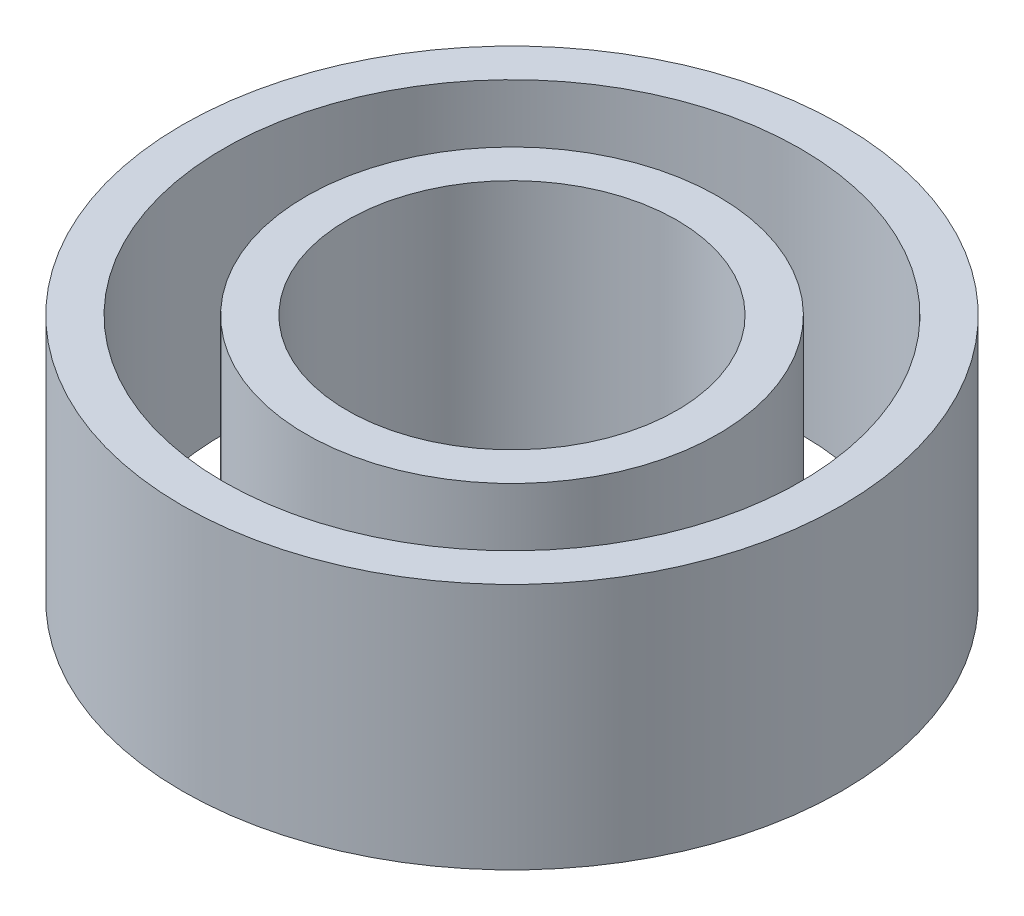
ISO-10303-21;
HEADER;
FILE_DESCRIPTION(('STEP AP214'),'2;1');
FILE_NAME('part.step','',(''),(''),'','','');
FILE_SCHEMA(('AUTOMOTIVE_DESIGN { 1 0 10303 214 1 1 1 1 }'));
ENDSEC;
DATA;
#1=APPLICATION_CONTEXT('core data for automotive mechanical design processes');
#2=APPLICATION_PROTOCOL_DEFINITION('international standard','automotive_design',2000,#1);
#3=PRODUCT_CONTEXT('',#1,'mechanical');
#4=PRODUCT('Part','Part','',(#3));
#5=PRODUCT_RELATED_PRODUCT_CATEGORY('part','',(#4));
#6=PRODUCT_DEFINITION_FORMATION('','',#4);
#7=PRODUCT_DEFINITION_CONTEXT('part definition',#1,'design');
#8=PRODUCT_DEFINITION('design','',#6,#7);
#9=PRODUCT_DEFINITION_SHAPE('','',#8);
#10=(LENGTH_UNIT() NAMED_UNIT(*) SI_UNIT(.MILLI.,.METRE.));
#11=(NAMED_UNIT(*) PLANE_ANGLE_UNIT() SI_UNIT($,.RADIAN.));
#12=(NAMED_UNIT(*) SI_UNIT($,.STERADIAN.) SOLID_ANGLE_UNIT());
#13=UNCERTAINTY_MEASURE_WITH_UNIT(LENGTH_MEASURE(1.E-05),#10,'distance_accuracy_value','');
#14=(GEOMETRIC_REPRESENTATION_CONTEXT(3) GLOBAL_UNCERTAINTY_ASSIGNED_CONTEXT((#13)) GLOBAL_UNIT_ASSIGNED_CONTEXT((#10,
#11,#12)) REPRESENTATION_CONTEXT('',''));
#15=CARTESIAN_POINT('',(0.,0.,0.));
#16=DIRECTION('',(0.,0.,1.));
#17=DIRECTION('',(1.,0.,0.));
#18=AXIS2_PLACEMENT_3D('',#15,#16,#17);
#19=CARTESIAN_POINT('',(0.,0.,0.));
#20=DIRECTION('',(0.,-1.,0.));
#21=DIRECTION('',(0.,0.,-1.));
#22=AXIS2_PLACEMENT_3D('',#19,#20,#21);
#23=CYLINDRICAL_SURFACE('',#22,3.5);
#24=CARTESIAN_POINT('',(0.,1.,0.));
#25=DIRECTION('',(0.,-1.,0.));
#26=DIRECTION('',(0.,0.,-1.));
#27=AXIS2_PLACEMENT_3D('',#24,#25,#26);
#28=CIRCLE('',#27,3.5);
#29=CARTESIAN_POINT('',(0.,1.,-3.5));
#30=VERTEX_POINT('',#29);
#31=EDGE_CURVE('E59',#30,#30,#28,.T.);
#32=ORIENTED_EDGE('',*,*,#31,.T.);
#33=EDGE_LOOP('',(#32));
#34=FACE_BOUND('',#33,.T.);
#35=CARTESIAN_POINT('',(0.,4.,0.));
#36=DIRECTION('',(0.,-1.,0.));
#37=DIRECTION('',(0.,0.,-1.));
#38=AXIS2_PLACEMENT_3D('',#35,#36,#37);
#39=CIRCLE('',#38,3.5);
#40=CARTESIAN_POINT('',(0.,4.,-3.5));
#41=VERTEX_POINT('',#40);
#42=EDGE_CURVE('E11',#41,#41,#39,.T.);
#43=ORIENTED_EDGE('',*,*,#42,.F.);
#44=EDGE_LOOP('',(#43));
#45=FACE_BOUND('',#44,.T.);
#46=ADVANCED_FACE('F45',(#34,#45),#23,.F.);
#47=CARTESIAN_POINT('',(3.5,4.,0.));
#48=DIRECTION('',(0.,1.,0.));
#49=DIRECTION('',(0.,0.,1.));
#50=AXIS2_PLACEMENT_3D('',#47,#48,#49);
#51=PLANE('',#50);
#52=ORIENTED_EDGE('',*,*,#42,.T.);
#53=EDGE_LOOP('',(#52));
#54=FACE_BOUND('',#53,.T.);
#55=CARTESIAN_POINT('',(0.,4.,0.));
#56=DIRECTION('',(0.,-1.,0.));
#57=DIRECTION('',(0.,0.,-1.));
#58=AXIS2_PLACEMENT_3D('',#55,#56,#57);
#59=CIRCLE('',#58,4.);
#60=CARTESIAN_POINT('',(0.,4.,-4.));
#61=VERTEX_POINT('',#60);
#62=EDGE_CURVE('E51',#61,#61,#59,.T.);
#63=ORIENTED_EDGE('',*,*,#62,.F.);
#64=EDGE_LOOP('',(#63));
#65=FACE_BOUND('',#64,.T.);
#66=ADVANCED_FACE('F75',(#54,#65),#51,.T.);
#67=CARTESIAN_POINT('',(0.,0.,0.));
#68=DIRECTION('',(0.,-1.,0.));
#69=DIRECTION('',(0.,0.,-1.));
#70=AXIS2_PLACEMENT_3D('',#67,#68,#69);
#71=CYLINDRICAL_SURFACE('',#70,4.);
#72=ORIENTED_EDGE('',*,*,#62,.T.);
#73=EDGE_LOOP('',(#72));
#74=FACE_BOUND('',#73,.T.);
#75=CARTESIAN_POINT('',(0.,1.,0.));
#76=DIRECTION('',(0.,-1.,0.));
#77=DIRECTION('',(0.,0.,-1.));
#78=AXIS2_PLACEMENT_3D('',#75,#76,#77);
#79=CIRCLE('',#78,4.);
#80=CARTESIAN_POINT('',(0.,1.,-4.));
#81=VERTEX_POINT('',#80);
#82=EDGE_CURVE('E55',#81,#81,#79,.T.);
#83=ORIENTED_EDGE('',*,*,#82,.F.);
#84=EDGE_LOOP('',(#83));
#85=FACE_BOUND('',#84,.T.);
#86=ADVANCED_FACE('F69',(#74,#85),#71,.T.);
#87=CARTESIAN_POINT('',(3.5,1.,0.));
#88=DIRECTION('',(0.,-1.,0.));
#89=DIRECTION('',(0.,0.,-1.));
#90=AXIS2_PLACEMENT_3D('',#87,#88,#89);
#91=PLANE('',#90);
#92=ORIENTED_EDGE('',*,*,#82,.T.);
#93=EDGE_LOOP('',(#92));
#94=FACE_BOUND('',#93,.T.);
#95=ORIENTED_EDGE('',*,*,#31,.F.);
#96=EDGE_LOOP('',(#95));
#97=FACE_BOUND('',#96,.T.);
#98=ADVANCED_FACE('F67',(#94,#97),#91,.T.);
#99=CLOSED_SHELL('',(#46,#66,#86,#98));
#100=MANIFOLD_SOLID_BREP('B2',#99);
#101=CARTESIAN_POINT('',(0.,0.,0.));
#102=DIRECTION('',(0.,-1.,0.));
#103=DIRECTION('',(0.,0.,-1.));
#104=AXIS2_PLACEMENT_3D('',#101,#102,#103);
#105=CYLINDRICAL_SURFACE('',#104,2.);
#106=CARTESIAN_POINT('',(0.,1.,0.));
#107=DIRECTION('',(0.,-1.,0.));
#108=DIRECTION('',(0.,0.,-1.));
#109=AXIS2_PLACEMENT_3D('',#106,#107,#108);
#110=CIRCLE('',#109,2.);
#111=CARTESIAN_POINT('',(0.,1.,-2.));
#112=VERTEX_POINT('',#111);
#113=EDGE_CURVE('E121',#112,#112,#110,.T.);
#114=ORIENTED_EDGE('',*,*,#113,.T.);
#115=EDGE_LOOP('',(#114));
#116=FACE_BOUND('',#115,.T.);
#117=CARTESIAN_POINT('',(0.,4.,0.));
#118=DIRECTION('',(0.,-1.,0.));
#119=DIRECTION('',(0.,0.,-1.));
#120=AXIS2_PLACEMENT_3D('',#117,#118,#119);
#121=CIRCLE('',#120,2.);
#122=CARTESIAN_POINT('',(0.,4.,-2.));
#123=VERTEX_POINT('',#122);
#124=EDGE_CURVE('E44',#123,#123,#121,.T.);
#125=ORIENTED_EDGE('',*,*,#124,.F.);
#126=EDGE_LOOP('',(#125));
#127=FACE_BOUND('',#126,.T.);
#128=ADVANCED_FACE('F107',(#116,#127),#105,.F.);
#129=CARTESIAN_POINT('',(2.,4.,0.));
#130=DIRECTION('',(0.,1.,0.));
#131=DIRECTION('',(0.,0.,1.));
#132=AXIS2_PLACEMENT_3D('',#129,#130,#131);
#133=PLANE('',#132);
#134=ORIENTED_EDGE('',*,*,#124,.T.);
#135=EDGE_LOOP('',(#134));
#136=FACE_BOUND('',#135,.T.);
#137=CARTESIAN_POINT('',(0.,4.,0.));
#138=DIRECTION('',(0.,-1.,0.));
#139=DIRECTION('',(0.,0.,-1.));
#140=AXIS2_PLACEMENT_3D('',#137,#138,#139);
#141=CIRCLE('',#140,2.5);
#142=CARTESIAN_POINT('',(0.,4.,-2.5));
#143=VERTEX_POINT('',#142);
#144=EDGE_CURVE('E113',#143,#143,#141,.T.);
#145=ORIENTED_EDGE('',*,*,#144,.F.);
#146=EDGE_LOOP('',(#145));
#147=FACE_BOUND('',#146,.T.);
#148=ADVANCED_FACE('F137',(#136,#147),#133,.T.);
#149=CARTESIAN_POINT('',(0.,0.,0.));
#150=DIRECTION('',(0.,-1.,0.));
#151=DIRECTION('',(0.,0.,-1.));
#152=AXIS2_PLACEMENT_3D('',#149,#150,#151);
#153=CYLINDRICAL_SURFACE('',#152,2.5);
#154=ORIENTED_EDGE('',*,*,#144,.T.);
#155=EDGE_LOOP('',(#154));
#156=FACE_BOUND('',#155,.T.);
#157=CARTESIAN_POINT('',(0.,1.,0.));
#158=DIRECTION('',(0.,-1.,0.));
#159=DIRECTION('',(0.,0.,-1.));
#160=AXIS2_PLACEMENT_3D('',#157,#158,#159);
#161=CIRCLE('',#160,2.5);
#162=CARTESIAN_POINT('',(0.,1.,-2.5));
#163=VERTEX_POINT('',#162);
#164=EDGE_CURVE('E117',#163,#163,#161,.T.);
#165=ORIENTED_EDGE('',*,*,#164,.F.);
#166=EDGE_LOOP('',(#165));
#167=FACE_BOUND('',#166,.T.);
#168=ADVANCED_FACE('F131',(#156,#167),#153,.T.);
#169=CARTESIAN_POINT('',(2.,1.,0.));
#170=DIRECTION('',(0.,-1.,0.));
#171=DIRECTION('',(0.,0.,-1.));
#172=AXIS2_PLACEMENT_3D('',#169,#170,#171);
#173=PLANE('',#172);
#174=ORIENTED_EDGE('',*,*,#164,.T.);
#175=EDGE_LOOP('',(#174));
#176=FACE_BOUND('',#175,.T.);
#177=ORIENTED_EDGE('',*,*,#113,.F.);
#178=EDGE_LOOP('',(#177));
#179=FACE_BOUND('',#178,.T.);
#180=ADVANCED_FACE('F129',(#176,#179),#173,.T.);
#181=CLOSED_SHELL('',(#128,#148,#168,#180));
#182=MANIFOLD_SOLID_BREP('B6',#181);
#183=ADVANCED_BREP_SHAPE_REPRESENTATION('',(#18,#100,#182),#14);
#184=SHAPE_DEFINITION_REPRESENTATION(#9,#183);
ENDSEC;
END-ISO-10303-21;
